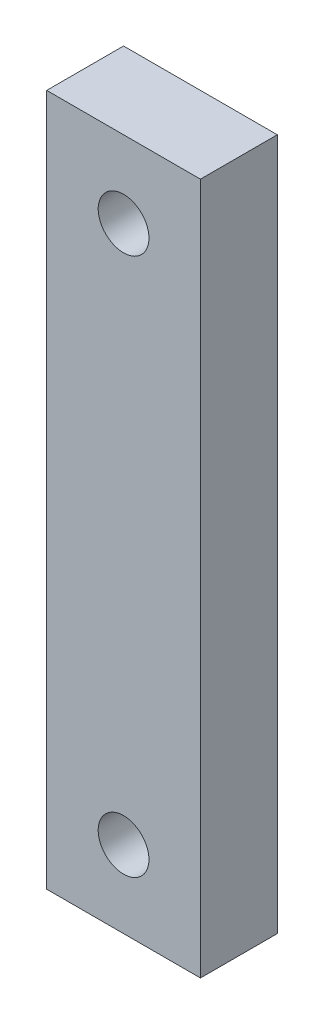
ISO-10303-21;
HEADER;
FILE_DESCRIPTION(('STEP AP214'),'2;1');
FILE_NAME('part.step','',(''),(''),'','','');
FILE_SCHEMA(('AUTOMOTIVE_DESIGN { 1 0 10303 214 1 1 1 1 }'));
ENDSEC;
DATA;
#1=APPLICATION_CONTEXT('core data for automotive mechanical design processes');
#2=APPLICATION_PROTOCOL_DEFINITION('international standard','automotive_design',2000,#1);
#3=PRODUCT_CONTEXT('',#1,'mechanical');
#4=PRODUCT('Part','Part','',(#3));
#5=PRODUCT_RELATED_PRODUCT_CATEGORY('part','',(#4));
#6=PRODUCT_DEFINITION_FORMATION('','',#4);
#7=PRODUCT_DEFINITION_CONTEXT('part definition',#1,'design');
#8=PRODUCT_DEFINITION('design','',#6,#7);
#9=PRODUCT_DEFINITION_SHAPE('','',#8);
#10=(LENGTH_UNIT() NAMED_UNIT(*) SI_UNIT(.MILLI.,.METRE.));
#11=(NAMED_UNIT(*) PLANE_ANGLE_UNIT() SI_UNIT($,.RADIAN.));
#12=(NAMED_UNIT(*) SI_UNIT($,.STERADIAN.) SOLID_ANGLE_UNIT());
#13=UNCERTAINTY_MEASURE_WITH_UNIT(LENGTH_MEASURE(1.E-05),#10,'distance_accuracy_value','');
#14=(GEOMETRIC_REPRESENTATION_CONTEXT(3) GLOBAL_UNCERTAINTY_ASSIGNED_CONTEXT((#13)) GLOBAL_UNIT_ASSIGNED_CONTEXT((#10,
#11,#12)) REPRESENTATION_CONTEXT('',''));
#15=CARTESIAN_POINT('',(0.,0.,0.));
#16=DIRECTION('',(0.,0.,1.));
#17=DIRECTION('',(1.,0.,0.));
#18=AXIS2_PLACEMENT_3D('',#15,#16,#17);
#19=CARTESIAN_POINT('',(0.,0.,5.));
#20=DIRECTION('',(0.,0.,1.));
#21=DIRECTION('',(1.,0.,0.));
#22=AXIS2_PLACEMENT_3D('',#19,#20,#21);
#23=PLANE('',#22);
#24=CARTESIAN_POINT('',(0.,17.5,5.));
#25=DIRECTION('',(0.,0.,1.));
#26=DIRECTION('',(1.,0.,0.));
#27=AXIS2_PLACEMENT_3D('',#24,#25,#26);
#28=CIRCLE('',#27,1.65);
#29=CARTESIAN_POINT('',(1.65,17.5,5.));
#30=VERTEX_POINT('',#29);
#31=EDGE_CURVE('E108',#30,#30,#28,.T.);
#32=ORIENTED_EDGE('',*,*,#31,.F.);
#33=EDGE_LOOP('',(#32));
#34=FACE_BOUND('',#33,.T.);
#35=DIRECTION('',(0.,1.,0.));
#36=VECTOR('',#35,1.);
#37=CARTESIAN_POINT('',(5.,22.5,5.));
#38=LINE('',#37,#36);
#39=CARTESIAN_POINT('',(5.,-22.5,5.));
#40=VERTEX_POINT('',#39);
#41=CARTESIAN_POINT('',(5.,22.5,5.));
#42=VERTEX_POINT('',#41);
#43=EDGE_CURVE('E93',#40,#42,#38,.T.);
#44=ORIENTED_EDGE('',*,*,#43,.T.);
#45=DIRECTION('',(-1.,0.,0.));
#46=VECTOR('',#45,1.);
#47=CARTESIAN_POINT('',(-5.,22.5,5.));
#48=LINE('',#47,#46);
#49=CARTESIAN_POINT('',(-5.,22.5,5.));
#50=VERTEX_POINT('',#49);
#51=EDGE_CURVE('E88',#42,#50,#48,.T.);
#52=ORIENTED_EDGE('',*,*,#51,.T.);
#53=DIRECTION('',(0.,-1.,0.));
#54=VECTOR('',#53,1.);
#55=CARTESIAN_POINT('',(-5.,22.5,5.));
#56=LINE('',#55,#54);
#57=CARTESIAN_POINT('',(-5.,-22.5,5.));
#58=VERTEX_POINT('',#57);
#59=EDGE_CURVE('E91',#50,#58,#56,.T.);
#60=ORIENTED_EDGE('',*,*,#59,.T.);
#61=DIRECTION('',(1.,0.,0.));
#62=VECTOR('',#61,1.);
#63=CARTESIAN_POINT('',(-5.,-22.5,5.));
#64=LINE('',#63,#62);
#65=EDGE_CURVE('E58',#58,#40,#64,.T.);
#66=ORIENTED_EDGE('',*,*,#65,.T.);
#67=EDGE_LOOP('',(#44,#52,#60,#66));
#68=FACE_BOUND('',#67,.T.);
#69=CARTESIAN_POINT('',(0.,-17.5,5.));
#70=DIRECTION('',(0.,0.,1.));
#71=DIRECTION('',(1.,0.,0.));
#72=AXIS2_PLACEMENT_3D('',#69,#70,#71);
#73=CIRCLE('',#72,1.65);
#74=CARTESIAN_POINT('',(1.65,-17.5,5.));
#75=VERTEX_POINT('',#74);
#76=EDGE_CURVE('E123',#75,#75,#73,.T.);
#77=ORIENTED_EDGE('',*,*,#76,.F.);
#78=EDGE_LOOP('',(#77));
#79=FACE_BOUND('',#78,.T.);
#80=ADVANCED_FACE('F41',(#34,#68,#79),#23,.T.);
#81=CARTESIAN_POINT('',(0.,0.,0.));
#82=DIRECTION('',(0.,0.,1.));
#83=DIRECTION('',(1.,0.,0.));
#84=AXIS2_PLACEMENT_3D('',#81,#82,#83);
#85=PLANE('',#84);
#86=DIRECTION('',(0.,1.,0.));
#87=VECTOR('',#86,1.);
#88=CARTESIAN_POINT('',(5.,22.5,0.));
#89=LINE('',#88,#87);
#90=CARTESIAN_POINT('',(5.,-22.5,0.));
#91=VERTEX_POINT('',#90);
#92=CARTESIAN_POINT('',(5.,22.5,0.));
#93=VERTEX_POINT('',#92);
#94=EDGE_CURVE('E105',#91,#93,#89,.T.);
#95=ORIENTED_EDGE('',*,*,#94,.F.);
#96=DIRECTION('',(1.,0.,0.));
#97=VECTOR('',#96,1.);
#98=CARTESIAN_POINT('',(-5.,-22.5,0.));
#99=LINE('',#98,#97);
#100=CARTESIAN_POINT('',(-5.,-22.5,0.));
#101=VERTEX_POINT('',#100);
#102=EDGE_CURVE('E81',#101,#91,#99,.T.);
#103=ORIENTED_EDGE('',*,*,#102,.F.);
#104=DIRECTION('',(0.,-1.,0.));
#105=VECTOR('',#104,1.);
#106=CARTESIAN_POINT('',(-5.,22.5,0.));
#107=LINE('',#106,#105);
#108=CARTESIAN_POINT('',(-5.,22.5,0.));
#109=VERTEX_POINT('',#108);
#110=EDGE_CURVE('E75',#109,#101,#107,.T.);
#111=ORIENTED_EDGE('',*,*,#110,.F.);
#112=DIRECTION('',(-1.,0.,0.));
#113=VECTOR('',#112,1.);
#114=CARTESIAN_POINT('',(-5.,22.5,0.));
#115=LINE('',#114,#113);
#116=EDGE_CURVE('E97',#93,#109,#115,.T.);
#117=ORIENTED_EDGE('',*,*,#116,.F.);
#118=EDGE_LOOP('',(#95,#103,#111,#117));
#119=FACE_BOUND('',#118,.T.);
#120=CARTESIAN_POINT('',(0.,17.5,0.));
#121=DIRECTION('',(0.,0.,1.));
#122=DIRECTION('',(1.,0.,0.));
#123=AXIS2_PLACEMENT_3D('',#120,#121,#122);
#124=CIRCLE('',#123,1.65);
#125=CARTESIAN_POINT('',(1.65,17.5,0.));
#126=VERTEX_POINT('',#125);
#127=EDGE_CURVE('E120',#126,#126,#124,.T.);
#128=ORIENTED_EDGE('',*,*,#127,.T.);
#129=EDGE_LOOP('',(#128));
#130=FACE_BOUND('',#129,.T.);
#131=CARTESIAN_POINT('',(0.,-17.5,0.));
#132=DIRECTION('',(0.,0.,1.));
#133=DIRECTION('',(1.,0.,0.));
#134=AXIS2_PLACEMENT_3D('',#131,#132,#133);
#135=CIRCLE('',#134,1.65);
#136=CARTESIAN_POINT('',(1.65,-17.5,0.));
#137=VERTEX_POINT('',#136);
#138=EDGE_CURVE('E126',#137,#137,#135,.T.);
#139=ORIENTED_EDGE('',*,*,#138,.T.);
#140=EDGE_LOOP('',(#139));
#141=FACE_BOUND('',#140,.T.);
#142=ADVANCED_FACE('F116',(#119,#130,#141),#85,.F.);
#143=CARTESIAN_POINT('',(5.,22.5,5.));
#144=DIRECTION('',(-1.,0.,0.));
#145=DIRECTION('',(0.,-1.,0.));
#146=AXIS2_PLACEMENT_3D('',#143,#144,#145);
#147=PLANE('',#146);
#148=ORIENTED_EDGE('',*,*,#94,.T.);
#149=DIRECTION('',(0.,0.,-1.));
#150=VECTOR('',#149,1.);
#151=CARTESIAN_POINT('',(5.,22.5,5.));
#152=LINE('',#151,#150);
#153=EDGE_CURVE('E11',#42,#93,#152,.T.);
#154=ORIENTED_EDGE('',*,*,#153,.F.);
#155=ORIENTED_EDGE('',*,*,#43,.F.);
#156=DIRECTION('',(0.,0.,-1.));
#157=VECTOR('',#156,1.);
#158=CARTESIAN_POINT('',(5.,-22.5,5.));
#159=LINE('',#158,#157);
#160=EDGE_CURVE('E101',#40,#91,#159,.T.);
#161=ORIENTED_EDGE('',*,*,#160,.T.);
#162=EDGE_LOOP('',(#148,#154,#155,#161));
#163=FACE_BOUND('',#162,.T.);
#164=ADVANCED_FACE('F43',(#163),#147,.F.);
#165=CARTESIAN_POINT('',(-5.,22.5,5.));
#166=DIRECTION('',(0.,-1.,0.));
#167=DIRECTION('',(0.,0.,-1.));
#168=AXIS2_PLACEMENT_3D('',#165,#166,#167);
#169=PLANE('',#168);
#170=ORIENTED_EDGE('',*,*,#116,.T.);
#171=DIRECTION('',(0.,0.,-1.));
#172=VECTOR('',#171,1.);
#173=CARTESIAN_POINT('',(-5.,22.5,5.));
#174=LINE('',#173,#172);
#175=EDGE_CURVE('E50',#50,#109,#174,.T.);
#176=ORIENTED_EDGE('',*,*,#175,.F.);
#177=ORIENTED_EDGE('',*,*,#51,.F.);
#178=ORIENTED_EDGE('',*,*,#153,.T.);
#179=EDGE_LOOP('',(#170,#176,#177,#178));
#180=FACE_BOUND('',#179,.T.);
#181=ADVANCED_FACE('F96',(#180),#169,.F.);
#182=CARTESIAN_POINT('',(-5.,22.5,5.));
#183=DIRECTION('',(1.,0.,0.));
#184=DIRECTION('',(0.,1.,0.));
#185=AXIS2_PLACEMENT_3D('',#182,#183,#184);
#186=PLANE('',#185);
#187=ORIENTED_EDGE('',*,*,#110,.T.);
#188=DIRECTION('',(0.,0.,-1.));
#189=VECTOR('',#188,1.);
#190=CARTESIAN_POINT('',(-5.,-22.5,5.));
#191=LINE('',#190,#189);
#192=EDGE_CURVE('E98',#58,#101,#191,.T.);
#193=ORIENTED_EDGE('',*,*,#192,.F.);
#194=ORIENTED_EDGE('',*,*,#59,.F.);
#195=ORIENTED_EDGE('',*,*,#175,.T.);
#196=EDGE_LOOP('',(#187,#193,#194,#195));
#197=FACE_BOUND('',#196,.T.);
#198=ADVANCED_FACE('F99',(#197),#186,.F.);
#199=CARTESIAN_POINT('',(-5.,-22.5,5.));
#200=DIRECTION('',(0.,1.,0.));
#201=DIRECTION('',(0.,0.,1.));
#202=AXIS2_PLACEMENT_3D('',#199,#200,#201);
#203=PLANE('',#202);
#204=ORIENTED_EDGE('',*,*,#102,.T.);
#205=ORIENTED_EDGE('',*,*,#160,.F.);
#206=ORIENTED_EDGE('',*,*,#65,.F.);
#207=ORIENTED_EDGE('',*,*,#192,.T.);
#208=EDGE_LOOP('',(#204,#205,#206,#207));
#209=FACE_BOUND('',#208,.T.);
#210=ADVANCED_FACE('F113',(#209),#203,.F.);
#211=CARTESIAN_POINT('',(0.,17.5,5.));
#212=DIRECTION('',(0.,0.,-1.));
#213=DIRECTION('',(-1.,0.,0.));
#214=AXIS2_PLACEMENT_3D('',#211,#212,#213);
#215=CYLINDRICAL_SURFACE('',#214,1.65);
#216=ORIENTED_EDGE('',*,*,#31,.T.);
#217=EDGE_LOOP('',(#216));
#218=FACE_BOUND('',#217,.T.);
#219=ORIENTED_EDGE('',*,*,#127,.F.);
#220=EDGE_LOOP('',(#219));
#221=FACE_BOUND('',#220,.T.);
#222=ADVANCED_FACE('F143',(#218,#221),#215,.F.);
#223=CARTESIAN_POINT('',(0.,-17.5,5.));
#224=DIRECTION('',(0.,0.,-1.));
#225=DIRECTION('',(-1.,0.,0.));
#226=AXIS2_PLACEMENT_3D('',#223,#224,#225);
#227=CYLINDRICAL_SURFACE('',#226,1.65);
#228=ORIENTED_EDGE('',*,*,#76,.T.);
#229=EDGE_LOOP('',(#228));
#230=FACE_BOUND('',#229,.T.);
#231=ORIENTED_EDGE('',*,*,#138,.F.);
#232=EDGE_LOOP('',(#231));
#233=FACE_BOUND('',#232,.T.);
#234=ADVANCED_FACE('F132',(#230,#233),#227,.F.);
#235=CLOSED_SHELL('',(#80,#142,#164,#181,#198,#210,#222,#234));
#236=MANIFOLD_SOLID_BREP('B2',#235);
#237=ADVANCED_BREP_SHAPE_REPRESENTATION('',(#18,#236),#14);
#238=SHAPE_DEFINITION_REPRESENTATION(#9,#237);
ENDSEC;
END-ISO-10303-21;
